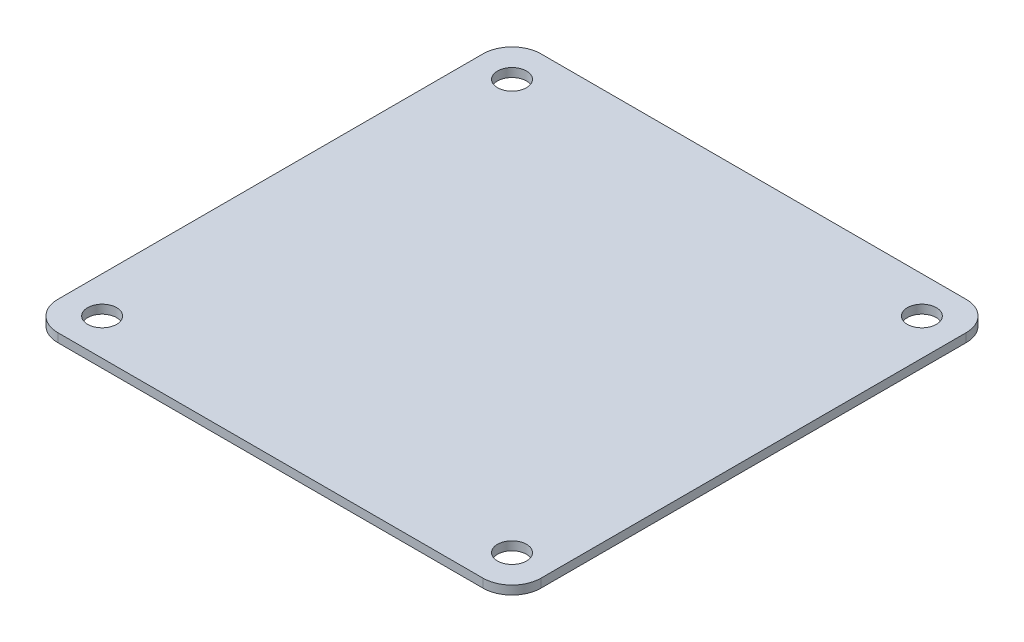
ISO-10303-21;
HEADER;
FILE_DESCRIPTION(('STEP AP214'),'2;1');
FILE_NAME('part.step','',(''),(''),'','','');
FILE_SCHEMA(('AUTOMOTIVE_DESIGN { 1 0 10303 214 1 1 1 1 }'));
ENDSEC;
DATA;
#1=APPLICATION_CONTEXT('core data for automotive mechanical design processes');
#2=APPLICATION_PROTOCOL_DEFINITION('international standard','automotive_design',2000,#1);
#3=PRODUCT_CONTEXT('',#1,'mechanical');
#4=PRODUCT('Part','Part','',(#3));
#5=PRODUCT_RELATED_PRODUCT_CATEGORY('part','',(#4));
#6=PRODUCT_DEFINITION_FORMATION('','',#4);
#7=PRODUCT_DEFINITION_CONTEXT('part definition',#1,'design');
#8=PRODUCT_DEFINITION('design','',#6,#7);
#9=PRODUCT_DEFINITION_SHAPE('','',#8);
#10=(LENGTH_UNIT() NAMED_UNIT(*) SI_UNIT(.MILLI.,.METRE.));
#11=(NAMED_UNIT(*) PLANE_ANGLE_UNIT() SI_UNIT($,.RADIAN.));
#12=(NAMED_UNIT(*) SI_UNIT($,.STERADIAN.) SOLID_ANGLE_UNIT());
#13=UNCERTAINTY_MEASURE_WITH_UNIT(LENGTH_MEASURE(1.E-05),#10,'distance_accuracy_value','');
#14=(GEOMETRIC_REPRESENTATION_CONTEXT(3) GLOBAL_UNCERTAINTY_ASSIGNED_CONTEXT((#13)) GLOBAL_UNIT_ASSIGNED_CONTEXT((#10,
#11,#12)) REPRESENTATION_CONTEXT('',''));
#15=CARTESIAN_POINT('',(0.,0.,0.));
#16=DIRECTION('',(0.,0.,1.));
#17=DIRECTION('',(1.,0.,0.));
#18=AXIS2_PLACEMENT_3D('',#15,#16,#17);
#19=CARTESIAN_POINT('',(0.,1.8,0.));
#20=DIRECTION('',(0.,1.,0.));
#21=DIRECTION('',(0.,0.,1.));
#22=AXIS2_PLACEMENT_3D('',#19,#20,#21);
#23=PLANE('',#22);
#24=CARTESIAN_POINT('',(42.425,1.8,42.425));
#25=DIRECTION('',(0.,1.,0.));
#26=DIRECTION('',(0.,0.,1.));
#27=AXIS2_PLACEMENT_3D('',#24,#25,#26);
#28=CIRCLE('',#27,3.);
#29=CARTESIAN_POINT('',(42.425,1.8,45.425));
#30=VERTEX_POINT('',#29);
#31=EDGE_CURVE('E187',#30,#30,#28,.T.);
#32=ORIENTED_EDGE('',*,*,#31,.F.);
#33=EDGE_LOOP('',(#32));
#34=FACE_BOUND('',#33,.T.);
#35=CARTESIAN_POINT('',(-42.425,1.8,-42.425));
#36=DIRECTION('',(0.,1.,0.));
#37=DIRECTION('',(0.,0.,1.));
#38=AXIS2_PLACEMENT_3D('',#35,#36,#37);
#39=CIRCLE('',#38,3.);
#40=CARTESIAN_POINT('',(-42.425,1.8,-39.425));
#41=VERTEX_POINT('',#40);
#42=EDGE_CURVE('E171',#41,#41,#39,.T.);
#43=ORIENTED_EDGE('',*,*,#42,.F.);
#44=EDGE_LOOP('',(#43));
#45=FACE_BOUND('',#44,.T.);
#46=DIRECTION('',(0.,0.,1.));
#47=VECTOR('',#46,1.);
#48=CARTESIAN_POINT('',(-50.,1.8,-50.));
#49=LINE('',#48,#47);
#50=CARTESIAN_POINT('',(-50.,1.8,-44.));
#51=VERTEX_POINT('',#50);
#52=CARTESIAN_POINT('',(-50.,1.8,44.));
#53=VERTEX_POINT('',#52);
#54=EDGE_CURVE('E175',#51,#53,#49,.T.);
#55=ORIENTED_EDGE('',*,*,#54,.T.);
#56=CARTESIAN_POINT('',(-44.,1.8,44.));
#57=DIRECTION('',(0.,1.,0.));
#58=DIRECTION('',(0.,0.,1.));
#59=AXIS2_PLACEMENT_3D('',#56,#57,#58);
#60=CIRCLE('',#59,6.);
#61=CARTESIAN_POINT('',(-44.,1.8,50.));
#62=VERTEX_POINT('',#61);
#63=EDGE_CURVE('E148',#53,#62,#60,.T.);
#64=ORIENTED_EDGE('',*,*,#63,.T.);
#65=DIRECTION('',(1.,0.,0.));
#66=VECTOR('',#65,1.);
#67=CARTESIAN_POINT('',(-50.,1.8,50.));
#68=LINE('',#67,#66);
#69=CARTESIAN_POINT('',(44.,1.8,50.));
#70=VERTEX_POINT('',#69);
#71=EDGE_CURVE('E119',#62,#70,#68,.T.);
#72=ORIENTED_EDGE('',*,*,#71,.T.);
#73=CARTESIAN_POINT('',(44.,1.8,44.));
#74=DIRECTION('',(0.,1.,0.));
#75=DIRECTION('',(0.,0.,1.));
#76=AXIS2_PLACEMENT_3D('',#73,#74,#75);
#77=CIRCLE('',#76,6.);
#78=CARTESIAN_POINT('',(50.,1.8,44.));
#79=VERTEX_POINT('',#78);
#80=EDGE_CURVE('E143',#70,#79,#77,.T.);
#81=ORIENTED_EDGE('',*,*,#80,.T.);
#82=DIRECTION('',(0.,0.,-1.));
#83=VECTOR('',#82,1.);
#84=CARTESIAN_POINT('',(50.,1.8,-50.));
#85=LINE('',#84,#83);
#86=CARTESIAN_POINT('',(50.,1.8,-44.));
#87=VERTEX_POINT('',#86);
#88=EDGE_CURVE('E126',#79,#87,#85,.T.);
#89=ORIENTED_EDGE('',*,*,#88,.T.);
#90=CARTESIAN_POINT('',(44.,1.8,-44.));
#91=DIRECTION('',(0.,1.,0.));
#92=DIRECTION('',(0.,0.,1.));
#93=AXIS2_PLACEMENT_3D('',#90,#91,#92);
#94=CIRCLE('',#93,6.);
#95=CARTESIAN_POINT('',(44.,1.8,-50.));
#96=VERTEX_POINT('',#95);
#97=EDGE_CURVE('E54',#87,#96,#94,.T.);
#98=ORIENTED_EDGE('',*,*,#97,.T.);
#99=DIRECTION('',(-1.,0.,0.));
#100=VECTOR('',#99,1.);
#101=CARTESIAN_POINT('',(-50.,1.8,-50.));
#102=LINE('',#101,#100);
#103=CARTESIAN_POINT('',(-44.,1.8,-50.));
#104=VERTEX_POINT('',#103);
#105=EDGE_CURVE('E129',#96,#104,#102,.T.);
#106=ORIENTED_EDGE('',*,*,#105,.T.);
#107=CARTESIAN_POINT('',(-44.,1.8,-44.));
#108=DIRECTION('',(0.,1.,0.));
#109=DIRECTION('',(0.,0.,1.));
#110=AXIS2_PLACEMENT_3D('',#107,#108,#109);
#111=CIRCLE('',#110,6.);
#112=EDGE_CURVE('E146',#104,#51,#111,.T.);
#113=ORIENTED_EDGE('',*,*,#112,.T.);
#114=EDGE_LOOP('',(#55,#64,#72,#81,#89,#98,#106,#113));
#115=FACE_BOUND('',#114,.T.);
#116=CARTESIAN_POINT('',(42.425,1.8,-42.425));
#117=DIRECTION('',(0.,1.,0.));
#118=DIRECTION('',(0.,0.,1.));
#119=AXIS2_PLACEMENT_3D('',#116,#117,#118);
#120=CIRCLE('',#119,3.);
#121=CARTESIAN_POINT('',(42.425,1.8,-39.425));
#122=VERTEX_POINT('',#121);
#123=EDGE_CURVE('E181',#122,#122,#120,.T.);
#124=ORIENTED_EDGE('',*,*,#123,.F.);
#125=EDGE_LOOP('',(#124));
#126=FACE_BOUND('',#125,.T.);
#127=CARTESIAN_POINT('',(-42.425,1.8,42.425));
#128=DIRECTION('',(0.,1.,0.));
#129=DIRECTION('',(0.,0.,1.));
#130=AXIS2_PLACEMENT_3D('',#127,#128,#129);
#131=CIRCLE('',#130,3.);
#132=CARTESIAN_POINT('',(-42.425,1.8,45.425));
#133=VERTEX_POINT('',#132);
#134=EDGE_CURVE('E193',#133,#133,#131,.T.);
#135=ORIENTED_EDGE('',*,*,#134,.F.);
#136=EDGE_LOOP('',(#135));
#137=FACE_BOUND('',#136,.T.);
#138=ADVANCED_FACE('F32',(#34,#45,#115,#126,#137),#23,.T.);
#139=CARTESIAN_POINT('',(0.,0.,0.));
#140=DIRECTION('',(0.,1.,0.));
#141=DIRECTION('',(0.,0.,1.));
#142=AXIS2_PLACEMENT_3D('',#139,#140,#141);
#143=PLANE('',#142);
#144=CARTESIAN_POINT('',(0.,0.,0.));
#145=DIRECTION('',(0.,1.,0.));
#146=DIRECTION('',(0.,0.,1.));
#147=AXIS2_PLACEMENT_3D('',#144,#145,#146);
#148=CIRCLE('',#147,42.);
#149=CARTESIAN_POINT('',(0.,0.,42.));
#150=VERTEX_POINT('',#149);
#151=EDGE_CURVE('E11',#150,#150,#148,.F.);
#152=ORIENTED_EDGE('',*,*,#151,.F.);
#153=EDGE_LOOP('',(#152));
#154=FACE_BOUND('',#153,.T.);
#155=DIRECTION('',(1.,0.,0.));
#156=VECTOR('',#155,1.);
#157=CARTESIAN_POINT('',(-50.,0.,50.));
#158=LINE('',#157,#156);
#159=CARTESIAN_POINT('',(-44.,0.,50.));
#160=VERTEX_POINT('',#159);
#161=CARTESIAN_POINT('',(44.,0.,50.));
#162=VERTEX_POINT('',#161);
#163=EDGE_CURVE('E116',#160,#162,#158,.T.);
#164=ORIENTED_EDGE('',*,*,#163,.F.);
#165=CARTESIAN_POINT('',(-44.,0.,44.));
#166=DIRECTION('',(0.,1.,0.));
#167=DIRECTION('',(0.,0.,1.));
#168=AXIS2_PLACEMENT_3D('',#165,#166,#167);
#169=CIRCLE('',#168,6.);
#170=CARTESIAN_POINT('',(-50.,0.,44.));
#171=VERTEX_POINT('',#170);
#172=EDGE_CURVE('E99',#160,#171,#169,.F.);
#173=ORIENTED_EDGE('',*,*,#172,.T.);
#174=DIRECTION('',(0.,0.,1.));
#175=VECTOR('',#174,1.);
#176=CARTESIAN_POINT('',(-50.,0.,-50.));
#177=LINE('',#176,#175);
#178=CARTESIAN_POINT('',(-50.,0.,-44.));
#179=VERTEX_POINT('',#178);
#180=EDGE_CURVE('E127',#179,#171,#177,.T.);
#181=ORIENTED_EDGE('',*,*,#180,.F.);
#182=CARTESIAN_POINT('',(-44.,0.,-44.));
#183=DIRECTION('',(0.,1.,0.));
#184=DIRECTION('',(0.,0.,1.));
#185=AXIS2_PLACEMENT_3D('',#182,#183,#184);
#186=CIRCLE('',#185,6.);
#187=CARTESIAN_POINT('',(-44.,0.,-50.));
#188=VERTEX_POINT('',#187);
#189=EDGE_CURVE('E110',#179,#188,#186,.F.);
#190=ORIENTED_EDGE('',*,*,#189,.T.);
#191=DIRECTION('',(-1.,0.,0.));
#192=VECTOR('',#191,1.);
#193=CARTESIAN_POINT('',(-50.,0.,-50.));
#194=LINE('',#193,#192);
#195=CARTESIAN_POINT('',(44.,0.,-50.));
#196=VERTEX_POINT('',#195);
#197=EDGE_CURVE('E131',#196,#188,#194,.T.);
#198=ORIENTED_EDGE('',*,*,#197,.F.);
#199=CARTESIAN_POINT('',(44.,0.,-44.));
#200=DIRECTION('',(0.,1.,0.));
#201=DIRECTION('',(0.,0.,1.));
#202=AXIS2_PLACEMENT_3D('',#199,#200,#201);
#203=CIRCLE('',#202,6.);
#204=CARTESIAN_POINT('',(50.,0.,-44.));
#205=VERTEX_POINT('',#204);
#206=EDGE_CURVE('E137',#196,#205,#203,.F.);
#207=ORIENTED_EDGE('',*,*,#206,.T.);
#208=DIRECTION('',(0.,0.,-1.));
#209=VECTOR('',#208,1.);
#210=CARTESIAN_POINT('',(50.,0.,-50.));
#211=LINE('',#210,#209);
#212=CARTESIAN_POINT('',(50.,0.,44.));
#213=VERTEX_POINT('',#212);
#214=EDGE_CURVE('E162',#213,#205,#211,.T.);
#215=ORIENTED_EDGE('',*,*,#214,.F.);
#216=CARTESIAN_POINT('',(44.,0.,44.));
#217=DIRECTION('',(0.,1.,0.));
#218=DIRECTION('',(0.,0.,1.));
#219=AXIS2_PLACEMENT_3D('',#216,#217,#218);
#220=CIRCLE('',#219,6.);
#221=EDGE_CURVE('E120',#213,#162,#220,.F.);
#222=ORIENTED_EDGE('',*,*,#221,.T.);
#223=EDGE_LOOP('',(#164,#173,#181,#190,#198,#207,#215,#222));
#224=FACE_BOUND('',#223,.T.);
#225=CARTESIAN_POINT('',(-42.425,0.,-42.425));
#226=DIRECTION('',(0.,1.,0.));
#227=DIRECTION('',(0.,0.,1.));
#228=AXIS2_PLACEMENT_3D('',#225,#226,#227);
#229=CIRCLE('',#228,3.);
#230=CARTESIAN_POINT('',(-42.425,0.,-39.425));
#231=VERTEX_POINT('',#230);
#232=EDGE_CURVE('E178',#231,#231,#229,.T.);
#233=ORIENTED_EDGE('',*,*,#232,.T.);
#234=EDGE_LOOP('',(#233));
#235=FACE_BOUND('',#234,.T.);
#236=CARTESIAN_POINT('',(42.425,0.,-42.425));
#237=DIRECTION('',(0.,1.,0.));
#238=DIRECTION('',(0.,0.,1.));
#239=AXIS2_PLACEMENT_3D('',#236,#237,#238);
#240=CIRCLE('',#239,3.);
#241=CARTESIAN_POINT('',(42.425,0.,-39.425));
#242=VERTEX_POINT('',#241);
#243=EDGE_CURVE('E184',#242,#242,#240,.T.);
#244=ORIENTED_EDGE('',*,*,#243,.T.);
#245=EDGE_LOOP('',(#244));
#246=FACE_BOUND('',#245,.T.);
#247=CARTESIAN_POINT('',(42.425,0.,42.425));
#248=DIRECTION('',(0.,1.,0.));
#249=DIRECTION('',(0.,0.,1.));
#250=AXIS2_PLACEMENT_3D('',#247,#248,#249);
#251=CIRCLE('',#250,3.);
#252=CARTESIAN_POINT('',(42.425,0.,45.425));
#253=VERTEX_POINT('',#252);
#254=EDGE_CURVE('E190',#253,#253,#251,.T.);
#255=ORIENTED_EDGE('',*,*,#254,.T.);
#256=EDGE_LOOP('',(#255));
#257=FACE_BOUND('',#256,.T.);
#258=CARTESIAN_POINT('',(-42.425,0.,42.425));
#259=DIRECTION('',(0.,1.,0.));
#260=DIRECTION('',(0.,0.,1.));
#261=AXIS2_PLACEMENT_3D('',#258,#259,#260);
#262=CIRCLE('',#261,3.);
#263=CARTESIAN_POINT('',(-42.425,0.,45.425));
#264=VERTEX_POINT('',#263);
#265=EDGE_CURVE('E196',#264,#264,#262,.T.);
#266=ORIENTED_EDGE('',*,*,#265,.T.);
#267=EDGE_LOOP('',(#266));
#268=FACE_BOUND('',#267,.T.);
#269=ADVANCED_FACE('F123',(#154,#224,#235,#246,#257,#268),#143,.F.);
#270=CARTESIAN_POINT('',(50.,1.8,-50.));
#271=DIRECTION('',(-1.,0.,0.));
#272=DIRECTION('',(0.,0.,1.));
#273=AXIS2_PLACEMENT_3D('',#270,#271,#272);
#274=PLANE('',#273);
#275=ORIENTED_EDGE('',*,*,#214,.T.);
#276=DIRECTION('',(0.,-1.,0.));
#277=VECTOR('',#276,1.);
#278=CARTESIAN_POINT('',(50.,1.8,-44.));
#279=LINE('',#278,#277);
#280=EDGE_CURVE('E40',#205,#87,#279,.F.);
#281=ORIENTED_EDGE('',*,*,#280,.T.);
#282=ORIENTED_EDGE('',*,*,#88,.F.);
#283=DIRECTION('',(0.,-1.,0.));
#284=VECTOR('',#283,1.);
#285=CARTESIAN_POINT('',(50.,1.8,44.));
#286=LINE('',#285,#284);
#287=EDGE_CURVE('E154',#79,#213,#286,.T.);
#288=ORIENTED_EDGE('',*,*,#287,.T.);
#289=EDGE_LOOP('',(#275,#281,#282,#288));
#290=FACE_BOUND('',#289,.T.);
#291=ADVANCED_FACE('F160',(#290),#274,.F.);
#292=CARTESIAN_POINT('',(-50.,1.8,-50.));
#293=DIRECTION('',(0.,0.,1.));
#294=DIRECTION('',(1.,0.,0.));
#295=AXIS2_PLACEMENT_3D('',#292,#293,#294);
#296=PLANE('',#295);
#297=ORIENTED_EDGE('',*,*,#197,.T.);
#298=DIRECTION('',(0.,-1.,0.));
#299=VECTOR('',#298,1.);
#300=CARTESIAN_POINT('',(-44.,1.8,-50.));
#301=LINE('',#300,#299);
#302=EDGE_CURVE('E47',#188,#104,#301,.F.);
#303=ORIENTED_EDGE('',*,*,#302,.T.);
#304=ORIENTED_EDGE('',*,*,#105,.F.);
#305=DIRECTION('',(0.,-1.,0.));
#306=VECTOR('',#305,1.);
#307=CARTESIAN_POINT('',(44.,1.8,-50.));
#308=LINE('',#307,#306);
#309=EDGE_CURVE('E150',#96,#196,#308,.T.);
#310=ORIENTED_EDGE('',*,*,#309,.T.);
#311=EDGE_LOOP('',(#297,#303,#304,#310));
#312=FACE_BOUND('',#311,.T.);
#313=ADVANCED_FACE('F170',(#312),#296,.F.);
#314=CARTESIAN_POINT('',(-50.,1.8,-50.));
#315=DIRECTION('',(1.,0.,0.));
#316=DIRECTION('',(0.,0.,-1.));
#317=AXIS2_PLACEMENT_3D('',#314,#315,#316);
#318=PLANE('',#317);
#319=ORIENTED_EDGE('',*,*,#180,.T.);
#320=DIRECTION('',(0.,-1.,0.));
#321=VECTOR('',#320,1.);
#322=CARTESIAN_POINT('',(-50.,1.8,44.));
#323=LINE('',#322,#321);
#324=EDGE_CURVE('E104',#171,#53,#323,.F.);
#325=ORIENTED_EDGE('',*,*,#324,.T.);
#326=ORIENTED_EDGE('',*,*,#54,.F.);
#327=DIRECTION('',(0.,-1.,0.));
#328=VECTOR('',#327,1.);
#329=CARTESIAN_POINT('',(-50.,1.8,-44.));
#330=LINE('',#329,#328);
#331=EDGE_CURVE('E109',#51,#179,#330,.T.);
#332=ORIENTED_EDGE('',*,*,#331,.T.);
#333=EDGE_LOOP('',(#319,#325,#326,#332));
#334=FACE_BOUND('',#333,.T.);
#335=ADVANCED_FACE('F244',(#334),#318,.F.);
#336=CARTESIAN_POINT('',(-50.,1.8,50.));
#337=DIRECTION('',(0.,0.,-1.));
#338=DIRECTION('',(-1.,0.,0.));
#339=AXIS2_PLACEMENT_3D('',#336,#337,#338);
#340=PLANE('',#339);
#341=ORIENTED_EDGE('',*,*,#71,.F.);
#342=DIRECTION('',(0.,-1.,0.));
#343=VECTOR('',#342,1.);
#344=CARTESIAN_POINT('',(-44.,1.8,50.));
#345=LINE('',#344,#343);
#346=EDGE_CURVE('E103',#62,#160,#345,.T.);
#347=ORIENTED_EDGE('',*,*,#346,.T.);
#348=ORIENTED_EDGE('',*,*,#163,.T.);
#349=DIRECTION('',(0.,-1.,0.));
#350=VECTOR('',#349,1.);
#351=CARTESIAN_POINT('',(44.,1.8,50.));
#352=LINE('',#351,#350);
#353=EDGE_CURVE('E121',#162,#70,#352,.F.);
#354=ORIENTED_EDGE('',*,*,#353,.T.);
#355=EDGE_LOOP('',(#341,#347,#348,#354));
#356=FACE_BOUND('',#355,.T.);
#357=ADVANCED_FACE('F115',(#356),#340,.F.);
#358=CARTESIAN_POINT('',(-42.425,1.8,-42.425));
#359=DIRECTION('',(0.,-1.,0.));
#360=DIRECTION('',(0.,0.,-1.));
#361=AXIS2_PLACEMENT_3D('',#358,#359,#360);
#362=CYLINDRICAL_SURFACE('',#361,3.);
#363=ORIENTED_EDGE('',*,*,#42,.T.);
#364=EDGE_LOOP('',(#363));
#365=FACE_BOUND('',#364,.T.);
#366=ORIENTED_EDGE('',*,*,#232,.F.);
#367=EDGE_LOOP('',(#366));
#368=FACE_BOUND('',#367,.T.);
#369=ADVANCED_FACE('F239',(#365,#368),#362,.F.);
#370=CARTESIAN_POINT('',(42.425,1.8,-42.425));
#371=DIRECTION('',(0.,-1.,0.));
#372=DIRECTION('',(0.,0.,-1.));
#373=AXIS2_PLACEMENT_3D('',#370,#371,#372);
#374=CYLINDRICAL_SURFACE('',#373,3.);
#375=ORIENTED_EDGE('',*,*,#123,.T.);
#376=EDGE_LOOP('',(#375));
#377=FACE_BOUND('',#376,.T.);
#378=ORIENTED_EDGE('',*,*,#243,.F.);
#379=EDGE_LOOP('',(#378));
#380=FACE_BOUND('',#379,.T.);
#381=ADVANCED_FACE('F325',(#377,#380),#374,.F.);
#382=CARTESIAN_POINT('',(42.425,1.8,42.425));
#383=DIRECTION('',(0.,-1.,0.));
#384=DIRECTION('',(0.,0.,-1.));
#385=AXIS2_PLACEMENT_3D('',#382,#383,#384);
#386=CYLINDRICAL_SURFACE('',#385,3.);
#387=ORIENTED_EDGE('',*,*,#31,.T.);
#388=EDGE_LOOP('',(#387));
#389=FACE_BOUND('',#388,.T.);
#390=ORIENTED_EDGE('',*,*,#254,.F.);
#391=EDGE_LOOP('',(#390));
#392=FACE_BOUND('',#391,.T.);
#393=ADVANCED_FACE('F332',(#389,#392),#386,.F.);
#394=CARTESIAN_POINT('',(-42.425,1.8,42.425));
#395=DIRECTION('',(0.,-1.,0.));
#396=DIRECTION('',(0.,0.,-1.));
#397=AXIS2_PLACEMENT_3D('',#394,#395,#396);
#398=CYLINDRICAL_SURFACE('',#397,3.);
#399=ORIENTED_EDGE('',*,*,#134,.T.);
#400=EDGE_LOOP('',(#399));
#401=FACE_BOUND('',#400,.T.);
#402=ORIENTED_EDGE('',*,*,#265,.F.);
#403=EDGE_LOOP('',(#402));
#404=FACE_BOUND('',#403,.T.);
#405=ADVANCED_FACE('F255',(#401,#404),#398,.F.);
#406=CARTESIAN_POINT('',(-44.,1.8,44.));
#407=DIRECTION('',(0.,-1.,0.));
#408=DIRECTION('',(0.,0.,-1.));
#409=AXIS2_PLACEMENT_3D('',#406,#407,#408);
#410=CYLINDRICAL_SURFACE('',#409,6.);
#411=ORIENTED_EDGE('',*,*,#63,.F.);
#412=ORIENTED_EDGE('',*,*,#324,.F.);
#413=ORIENTED_EDGE('',*,*,#172,.F.);
#414=ORIENTED_EDGE('',*,*,#346,.F.);
#415=EDGE_LOOP('',(#411,#412,#413,#414));
#416=FACE_BOUND('',#415,.T.);
#417=ADVANCED_FACE('F102',(#416),#410,.T.);
#418=CARTESIAN_POINT('',(-44.,1.8,-44.));
#419=DIRECTION('',(0.,-1.,0.));
#420=DIRECTION('',(0.,0.,-1.));
#421=AXIS2_PLACEMENT_3D('',#418,#419,#420);
#422=CYLINDRICAL_SURFACE('',#421,6.);
#423=ORIENTED_EDGE('',*,*,#112,.F.);
#424=ORIENTED_EDGE('',*,*,#302,.F.);
#425=ORIENTED_EDGE('',*,*,#189,.F.);
#426=ORIENTED_EDGE('',*,*,#331,.F.);
#427=EDGE_LOOP('',(#423,#424,#425,#426));
#428=FACE_BOUND('',#427,.T.);
#429=ADVANCED_FACE('F254',(#428),#422,.T.);
#430=CARTESIAN_POINT('',(44.,1.8,-44.));
#431=DIRECTION('',(0.,-1.,0.));
#432=DIRECTION('',(0.,0.,-1.));
#433=AXIS2_PLACEMENT_3D('',#430,#431,#432);
#434=CYLINDRICAL_SURFACE('',#433,6.);
#435=ORIENTED_EDGE('',*,*,#97,.F.);
#436=ORIENTED_EDGE('',*,*,#280,.F.);
#437=ORIENTED_EDGE('',*,*,#206,.F.);
#438=ORIENTED_EDGE('',*,*,#309,.F.);
#439=EDGE_LOOP('',(#435,#436,#437,#438));
#440=FACE_BOUND('',#439,.T.);
#441=ADVANCED_FACE('F168',(#440),#434,.T.);
#442=CARTESIAN_POINT('',(44.,1.8,44.));
#443=DIRECTION('',(0.,-1.,0.));
#444=DIRECTION('',(0.,0.,-1.));
#445=AXIS2_PLACEMENT_3D('',#442,#443,#444);
#446=CYLINDRICAL_SURFACE('',#445,6.);
#447=ORIENTED_EDGE('',*,*,#80,.F.);
#448=ORIENTED_EDGE('',*,*,#353,.F.);
#449=ORIENTED_EDGE('',*,*,#221,.F.);
#450=ORIENTED_EDGE('',*,*,#287,.F.);
#451=EDGE_LOOP('',(#447,#448,#449,#450));
#452=FACE_BOUND('',#451,.T.);
#453=ADVANCED_FACE('F34',(#452),#446,.T.);
#454=CARTESIAN_POINT('',(0.,-3.,0.));
#455=DIRECTION('',(0.,-1.,0.));
#456=DIRECTION('',(0.,0.,-1.));
#457=AXIS2_PLACEMENT_3D('',#454,#455,#456);
#458=PLANE('',#457);
#459=CARTESIAN_POINT('',(0.,-3.,0.));
#460=DIRECTION('',(0.,-1.,0.));
#461=DIRECTION('',(0.,0.,-1.));
#462=AXIS2_PLACEMENT_3D('',#459,#460,#461);
#463=CIRCLE('',#462,42.);
#464=CARTESIAN_POINT('',(0.,-3.,-42.));
#465=VERTEX_POINT('',#464);
#466=EDGE_CURVE('E199',#465,#465,#463,.T.);
#467=ORIENTED_EDGE('',*,*,#466,.T.);
#468=EDGE_LOOP('',(#467));
#469=FACE_BOUND('',#468,.T.);
#470=CARTESIAN_POINT('',(0.,-3.,0.));
#471=DIRECTION('',(0.,-1.,0.));
#472=DIRECTION('',(0.,0.,-1.));
#473=AXIS2_PLACEMENT_3D('',#470,#471,#472);
#474=CIRCLE('',#473,40.);
#475=CARTESIAN_POINT('',(0.,-3.,-40.));
#476=VERTEX_POINT('',#475);
#477=EDGE_CURVE('E204',#476,#476,#474,.T.);
#478=ORIENTED_EDGE('',*,*,#477,.F.);
#479=EDGE_LOOP('',(#478));
#480=FACE_BOUND('',#479,.T.);
#481=ADVANCED_FACE('F214',(#469,#480),#458,.T.);
#482=CARTESIAN_POINT('',(0.,-3.,0.));
#483=DIRECTION('',(0.,1.,0.));
#484=DIRECTION('',(0.,0.,1.));
#485=AXIS2_PLACEMENT_3D('',#482,#483,#484);
#486=CYLINDRICAL_SURFACE('',#485,42.);
#487=ORIENTED_EDGE('',*,*,#466,.F.);
#488=EDGE_LOOP('',(#487));
#489=FACE_BOUND('',#488,.T.);
#490=ORIENTED_EDGE('',*,*,#151,.T.);
#491=EDGE_LOOP('',(#490));
#492=FACE_BOUND('',#491,.T.);
#493=ADVANCED_FACE('F216',(#489,#492),#486,.T.);
#494=CARTESIAN_POINT('',(0.,-3.,0.));
#495=DIRECTION('',(0.,1.,0.));
#496=DIRECTION('',(0.,0.,1.));
#497=AXIS2_PLACEMENT_3D('',#494,#495,#496);
#498=CYLINDRICAL_SURFACE('',#497,40.);
#499=ORIENTED_EDGE('',*,*,#477,.T.);
#500=EDGE_LOOP('',(#499));
#501=FACE_BOUND('',#500,.T.);
#502=CARTESIAN_POINT('',(0.,0.,0.));
#503=DIRECTION('',(0.,-1.,0.));
#504=DIRECTION('',(0.,0.,-1.));
#505=AXIS2_PLACEMENT_3D('',#502,#503,#504);
#506=CIRCLE('',#505,40.);
#507=CARTESIAN_POINT('',(0.,0.,-40.));
#508=VERTEX_POINT('',#507);
#509=EDGE_CURVE('E205',#508,#508,#506,.T.);
#510=ORIENTED_EDGE('',*,*,#509,.F.);
#511=EDGE_LOOP('',(#510));
#512=FACE_BOUND('',#511,.T.);
#513=ADVANCED_FACE('F211',(#501,#512),#498,.F.);
#514=ORIENTED_EDGE('',*,*,#509,.T.);
#515=EDGE_LOOP('',(#514));
#516=FACE_BOUND('',#515,.T.);
#517=ADVANCED_FACE('F235',(#516),#143,.F.);
#518=CLOSED_SHELL('',(#138,#269,#291,#313,#335,#357,#369,#381,#393,#405,#417,#429,#441,#453,
#481,#493,#513,#517));
#519=MANIFOLD_SOLID_BREP('B2',#518);
#520=ADVANCED_BREP_SHAPE_REPRESENTATION('',(#18,#519),#14);
#521=SHAPE_DEFINITION_REPRESENTATION(#9,#520);
ENDSEC;
END-ISO-10303-21;
